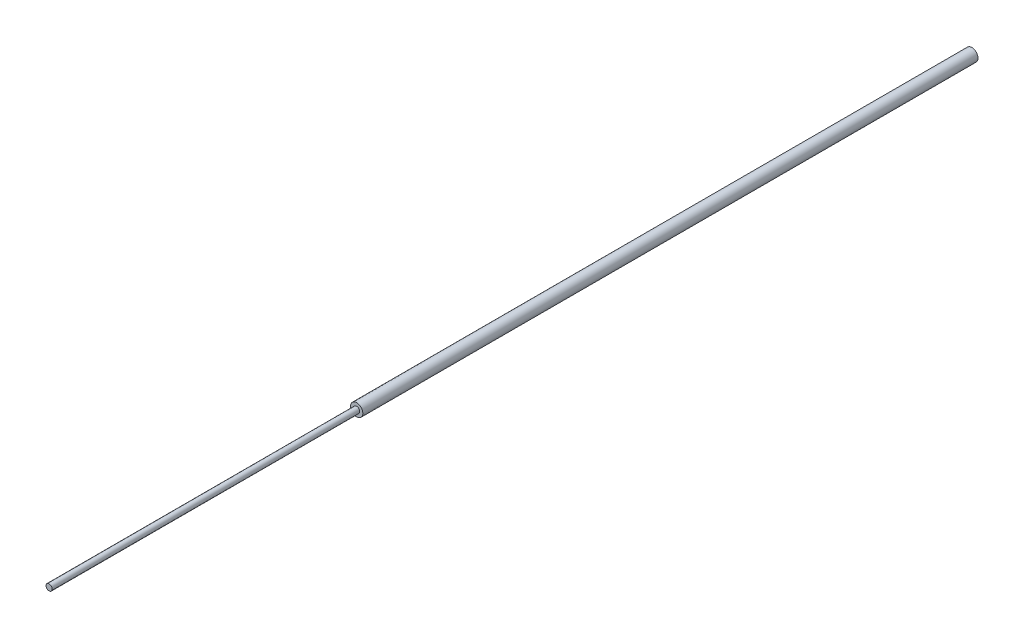
ISO-10303-21;
HEADER;
FILE_DESCRIPTION(('STEP AP214'),'2;1');
FILE_NAME('part.step','',(''),(''),'','','');
FILE_SCHEMA(('AUTOMOTIVE_DESIGN { 1 0 10303 214 1 1 1 1 }'));
ENDSEC;
DATA;
#1=APPLICATION_CONTEXT('core data for automotive mechanical design processes');
#2=APPLICATION_PROTOCOL_DEFINITION('international standard','automotive_design',2000,#1);
#3=PRODUCT_CONTEXT('',#1,'mechanical');
#4=PRODUCT('Part','Part','',(#3));
#5=PRODUCT_RELATED_PRODUCT_CATEGORY('part','',(#4));
#6=PRODUCT_DEFINITION_FORMATION('','',#4);
#7=PRODUCT_DEFINITION_CONTEXT('part definition',#1,'design');
#8=PRODUCT_DEFINITION('design','',#6,#7);
#9=PRODUCT_DEFINITION_SHAPE('','',#8);
#10=(LENGTH_UNIT() NAMED_UNIT(*) SI_UNIT(.MILLI.,.METRE.));
#11=(NAMED_UNIT(*) PLANE_ANGLE_UNIT() SI_UNIT($,.RADIAN.));
#12=(NAMED_UNIT(*) SI_UNIT($,.STERADIAN.) SOLID_ANGLE_UNIT());
#13=UNCERTAINTY_MEASURE_WITH_UNIT(LENGTH_MEASURE(1.E-05),#10,'distance_accuracy_value','');
#14=(GEOMETRIC_REPRESENTATION_CONTEXT(3) GLOBAL_UNCERTAINTY_ASSIGNED_CONTEXT((#13)) GLOBAL_UNIT_ASSIGNED_CONTEXT((#10,
#11,#12)) REPRESENTATION_CONTEXT('',''));
#15=CARTESIAN_POINT('',(0.,0.,0.));
#16=DIRECTION('',(0.,0.,1.));
#17=DIRECTION('',(1.,0.,0.));
#18=AXIS2_PLACEMENT_3D('',#15,#16,#17);
#19=CARTESIAN_POINT('',(0.,0.,300.));
#20=DIRECTION('',(0.,0.,-1.));
#21=DIRECTION('',(-1.,0.,0.));
#22=AXIS2_PLACEMENT_3D('',#19,#20,#21);
#23=CYLINDRICAL_SURFACE('',#22,3.);
#24=CARTESIAN_POINT('',(0.,0.,300.));
#25=DIRECTION('',(0.,0.,1.));
#26=DIRECTION('',(1.,0.,0.));
#27=AXIS2_PLACEMENT_3D('',#24,#25,#26);
#28=CIRCLE('',#27,3.);
#29=CARTESIAN_POINT('',(3.,0.,300.));
#30=VERTEX_POINT('',#29);
#31=EDGE_CURVE('E10',#30,#30,#28,.T.);
#32=ORIENTED_EDGE('',*,*,#31,.F.);
#33=EDGE_LOOP('',(#32));
#34=FACE_BOUND('',#33,.T.);
#35=CARTESIAN_POINT('',(0.,0.,0.));
#36=DIRECTION('',(0.,0.,1.));
#37=DIRECTION('',(1.,0.,0.));
#38=AXIS2_PLACEMENT_3D('',#35,#36,#37);
#39=CIRCLE('',#38,3.);
#40=CARTESIAN_POINT('',(3.,0.,0.));
#41=VERTEX_POINT('',#40);
#42=EDGE_CURVE('E38',#41,#41,#39,.T.);
#43=ORIENTED_EDGE('',*,*,#42,.T.);
#44=EDGE_LOOP('',(#43));
#45=FACE_BOUND('',#44,.T.);
#46=ADVANCED_FACE('F35',(#34,#45),#23,.T.);
#47=CARTESIAN_POINT('',(0.,0.,300.));
#48=DIRECTION('',(0.,0.,1.));
#49=DIRECTION('',(1.,0.,0.));
#50=AXIS2_PLACEMENT_3D('',#47,#48,#49);
#51=PLANE('',#50);
#52=CARTESIAN_POINT('',(0.,0.,300.));
#53=DIRECTION('',(0.,0.,1.));
#54=DIRECTION('',(1.,0.,0.));
#55=AXIS2_PLACEMENT_3D('',#52,#53,#54);
#56=CIRCLE('',#55,1.5);
#57=CARTESIAN_POINT('',(1.5,0.,300.));
#58=VERTEX_POINT('',#57);
#59=EDGE_CURVE('E47',#58,#58,#56,.T.);
#60=ORIENTED_EDGE('',*,*,#59,.F.);
#61=EDGE_LOOP('',(#60));
#62=FACE_BOUND('',#61,.T.);
#63=ORIENTED_EDGE('',*,*,#31,.T.);
#64=EDGE_LOOP('',(#63));
#65=FACE_BOUND('',#64,.T.);
#66=ADVANCED_FACE('F62',(#62,#65),#51,.T.);
#67=CARTESIAN_POINT('',(0.,0.,0.));
#68=DIRECTION('',(0.,0.,1.));
#69=DIRECTION('',(1.,0.,0.));
#70=AXIS2_PLACEMENT_3D('',#67,#68,#69);
#71=PLANE('',#70);
#72=ORIENTED_EDGE('',*,*,#42,.F.);
#73=EDGE_LOOP('',(#72));
#74=FACE_BOUND('',#73,.T.);
#75=ADVANCED_FACE('F58',(#74),#71,.F.);
#76=CARTESIAN_POINT('',(0.,0.,450.));
#77=DIRECTION('',(0.,0.,-1.));
#78=DIRECTION('',(-1.,0.,0.));
#79=AXIS2_PLACEMENT_3D('',#76,#77,#78);
#80=CYLINDRICAL_SURFACE('',#79,1.5);
#81=CARTESIAN_POINT('',(0.,0.,450.));
#82=DIRECTION('',(0.,0.,1.));
#83=DIRECTION('',(1.,0.,0.));
#84=AXIS2_PLACEMENT_3D('',#81,#82,#83);
#85=CIRCLE('',#84,1.5);
#86=CARTESIAN_POINT('',(1.5,0.,450.));
#87=VERTEX_POINT('',#86);
#88=EDGE_CURVE('E45',#87,#87,#85,.T.);
#89=ORIENTED_EDGE('',*,*,#88,.F.);
#90=EDGE_LOOP('',(#89));
#91=FACE_BOUND('',#90,.T.);
#92=ORIENTED_EDGE('',*,*,#59,.T.);
#93=EDGE_LOOP('',(#92));
#94=FACE_BOUND('',#93,.T.);
#95=ADVANCED_FACE('F55',(#91,#94),#80,.T.);
#96=CARTESIAN_POINT('',(0.,0.,450.));
#97=DIRECTION('',(0.,0.,1.));
#98=DIRECTION('',(1.,0.,0.));
#99=AXIS2_PLACEMENT_3D('',#96,#97,#98);
#100=PLANE('',#99);
#101=ORIENTED_EDGE('',*,*,#88,.T.);
#102=EDGE_LOOP('',(#101));
#103=FACE_BOUND('',#102,.T.);
#104=ADVANCED_FACE('F53',(#103),#100,.T.);
#105=CLOSED_SHELL('',(#46,#66,#75,#95,#104));
#106=MANIFOLD_SOLID_BREP('B2',#105);
#107=ADVANCED_BREP_SHAPE_REPRESENTATION('',(#18,#106),#14);
#108=SHAPE_DEFINITION_REPRESENTATION(#9,#107);
ENDSEC;
END-ISO-10303-21;
